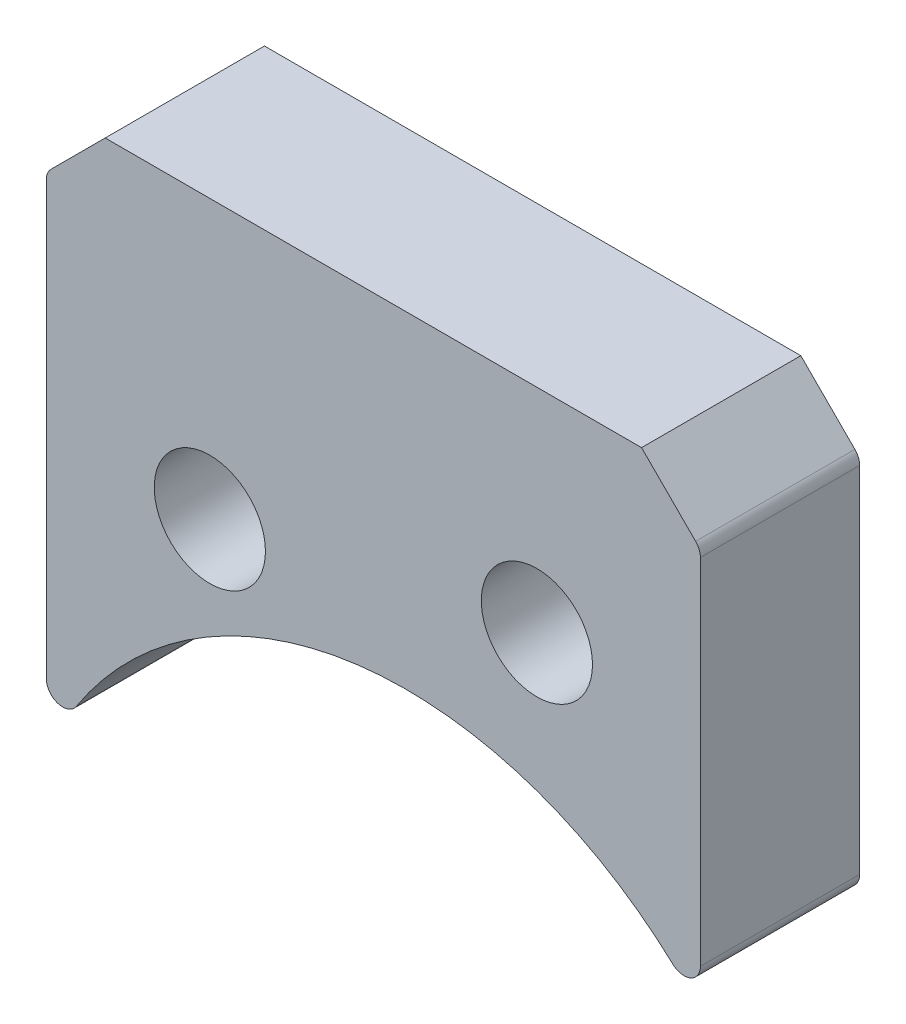
ISO-10303-21;
HEADER;
FILE_DESCRIPTION(('STEP AP214'),'2;1');
FILE_NAME('part.step','',(''),(''),'','','');
FILE_SCHEMA(('AUTOMOTIVE_DESIGN { 1 0 10303 214 1 1 1 1 }'));
ENDSEC;
DATA;
#1=APPLICATION_CONTEXT('core data for automotive mechanical design processes');
#2=APPLICATION_PROTOCOL_DEFINITION('international standard','automotive_design',2000,#1);
#3=PRODUCT_CONTEXT('',#1,'mechanical');
#4=PRODUCT('Part','Part','',(#3));
#5=PRODUCT_RELATED_PRODUCT_CATEGORY('part','',(#4));
#6=PRODUCT_DEFINITION_FORMATION('','',#4);
#7=PRODUCT_DEFINITION_CONTEXT('part definition',#1,'design');
#8=PRODUCT_DEFINITION('design','',#6,#7);
#9=PRODUCT_DEFINITION_SHAPE('','',#8);
#10=(LENGTH_UNIT() NAMED_UNIT(*) SI_UNIT(.MILLI.,.METRE.));
#11=(NAMED_UNIT(*) PLANE_ANGLE_UNIT() SI_UNIT($,.RADIAN.));
#12=(NAMED_UNIT(*) SI_UNIT($,.STERADIAN.) SOLID_ANGLE_UNIT());
#13=UNCERTAINTY_MEASURE_WITH_UNIT(LENGTH_MEASURE(1.E-05),#10,'distance_accuracy_value','');
#14=(GEOMETRIC_REPRESENTATION_CONTEXT(3) GLOBAL_UNCERTAINTY_ASSIGNED_CONTEXT((#13)) GLOBAL_UNIT_ASSIGNED_CONTEXT((#10,
#11,#12)) REPRESENTATION_CONTEXT('',''));
#15=CARTESIAN_POINT('',(0.,0.,0.));
#16=DIRECTION('',(0.,0.,1.));
#17=DIRECTION('',(1.,0.,0.));
#18=AXIS2_PLACEMENT_3D('',#15,#16,#17);
#19=CARTESIAN_POINT('',(-9.,-22.,4.87));
#20=DIRECTION('',(0.,0.,1.));
#21=DIRECTION('',(1.,0.,0.));
#22=AXIS2_PLACEMENT_3D('',#19,#20,#21);
#23=PLANE('',#22);
#24=CARTESIAN_POINT('',(-15.,-8.5,4.87));
#25=DIRECTION('',(0.,0.,1.));
#26=DIRECTION('',(1.,0.,0.));
#27=AXIS2_PLACEMENT_3D('',#24,#25,#26);
#28=CIRCLE('',#27,1.7);
#29=CARTESIAN_POINT('',(-13.3,-8.5,4.87));
#30=VERTEX_POINT('',#29);
#31=EDGE_CURVE('E161',#30,#30,#28,.T.);
#32=ORIENTED_EDGE('',*,*,#31,.F.);
#33=EDGE_LOOP('',(#32));
#34=FACE_BOUND('',#33,.T.);
#35=CARTESIAN_POINT('',(-9.,-22.,4.87));
#36=DIRECTION('',(0.,0.,-1.));
#37=DIRECTION('',(1.,0.,0.));
#38=AXIS2_PLACEMENT_3D('',#35,#36,#37);
#39=CIRCLE('',#38,12.);
#40=CARTESIAN_POINT('',(-19.08,-15.4889632161997,4.87));
#41=VERTEX_POINT('',#40);
#42=CARTESIAN_POINT('',(-0.840000000000002,-13.2014546656848,4.87));
#43=VERTEX_POINT('',#42);
#44=EDGE_CURVE('E170',#41,#43,#39,.T.);
#45=ORIENTED_EDGE('',*,*,#44,.T.);
#46=CARTESIAN_POINT('',(-0.5,-12.8348486100883,4.87));
#47=DIRECTION('',(0.,0.,1.));
#48=DIRECTION('',(1.,0.,0.));
#49=AXIS2_PLACEMENT_3D('',#46,#47,#48);
#50=CIRCLE('',#49,0.5);
#51=CARTESIAN_POINT('',(0.,-12.8348486100883,4.87));
#52=VERTEX_POINT('',#51);
#53=EDGE_CURVE('E214',#43,#52,#50,.T.);
#54=ORIENTED_EDGE('',*,*,#53,.T.);
#55=DIRECTION('',(0.,1.,0.));
#56=VECTOR('',#55,1.);
#57=CARTESIAN_POINT('',(0.,-14.0627460668062,4.87));
#58=LINE('',#57,#56);
#59=CARTESIAN_POINT('',(0.,-2.00710678118655,4.87));
#60=VERTEX_POINT('',#59);
#61=EDGE_CURVE('E168',#52,#60,#58,.T.);
#62=ORIENTED_EDGE('',*,*,#61,.T.);
#63=CARTESIAN_POINT('',(-0.5,-2.00710678118655,4.87));
#64=DIRECTION('',(0.,0.,1.));
#65=DIRECTION('',(1.,0.,0.));
#66=AXIS2_PLACEMENT_3D('',#63,#64,#65);
#67=CIRCLE('',#66,0.5);
#68=CARTESIAN_POINT('',(-0.146446609406728,-1.65355339059328,4.87));
#69=VERTEX_POINT('',#68);
#70=EDGE_CURVE('E206',#60,#69,#67,.T.);
#71=ORIENTED_EDGE('',*,*,#70,.T.);
#72=DIRECTION('',(0.707106781186546,-0.707106781186549,0.));
#73=VECTOR('',#72,1.);
#74=CARTESIAN_POINT('',(5.60000000000001,-7.40000000000004,4.87));
#75=LINE('',#74,#73);
#76=CARTESIAN_POINT('',(-1.8,0.,4.87));
#77=VERTEX_POINT('',#76);
#78=EDGE_CURVE('E176',#69,#77,#75,.F.);
#79=ORIENTED_EDGE('',*,*,#78,.T.);
#80=DIRECTION('',(-1.,0.,0.));
#81=VECTOR('',#80,1.);
#82=CARTESIAN_POINT('',(-20.,0.,4.87));
#83=LINE('',#82,#81);
#84=CARTESIAN_POINT('',(-18.2,0.,4.87));
#85=VERTEX_POINT('',#84);
#86=EDGE_CURVE('E144',#77,#85,#83,.T.);
#87=ORIENTED_EDGE('',*,*,#86,.T.);
#88=DIRECTION('',(0.707106781186549,0.707106781186546,0.));
#89=VECTOR('',#88,1.);
#90=CARTESIAN_POINT('',(-24.6,-6.39999999999996,4.87));
#91=LINE('',#90,#89);
#92=CARTESIAN_POINT('',(-19.8535533905933,-1.65355339059327,4.87));
#93=VERTEX_POINT('',#92);
#94=EDGE_CURVE('E134',#85,#93,#91,.F.);
#95=ORIENTED_EDGE('',*,*,#94,.T.);
#96=CARTESIAN_POINT('',(-19.5,-2.00710678118654,4.87));
#97=DIRECTION('',(0.,0.,1.));
#98=DIRECTION('',(1.,0.,0.));
#99=AXIS2_PLACEMENT_3D('',#96,#97,#98);
#100=CIRCLE('',#99,0.5);
#101=CARTESIAN_POINT('',(-20.,-2.00710678118654,4.87));
#102=VERTEX_POINT('',#101);
#103=EDGE_CURVE('E68',#93,#102,#100,.T.);
#104=ORIENTED_EDGE('',*,*,#103,.T.);
#105=DIRECTION('',(0.,-1.,0.));
#106=VECTOR('',#105,1.);
#107=CARTESIAN_POINT('',(-20.,-17.2041684766873,4.87));
#108=LINE('',#107,#106);
#109=CARTESIAN_POINT('',(-20.,-15.2176700168747,4.87));
#110=VERTEX_POINT('',#109);
#111=EDGE_CURVE('E234',#102,#110,#108,.T.);
#112=ORIENTED_EDGE('',*,*,#111,.T.);
#113=CARTESIAN_POINT('',(-19.5,-15.2176700168747,4.87));
#114=DIRECTION('',(0.,0.,1.));
#115=DIRECTION('',(1.,0.,0.));
#116=AXIS2_PLACEMENT_3D('',#113,#114,#115);
#117=CIRCLE('',#116,0.5);
#118=EDGE_CURVE('E211',#110,#41,#117,.T.);
#119=ORIENTED_EDGE('',*,*,#118,.T.);
#120=EDGE_LOOP('',(#45,#54,#62,#71,#79,#87,#95,#104,#112,#119));
#121=FACE_BOUND('',#120,.T.);
#122=CARTESIAN_POINT('',(-5.,-6.5,4.87));
#123=DIRECTION('',(0.,0.,1.));
#124=DIRECTION('',(1.,0.,0.));
#125=AXIS2_PLACEMENT_3D('',#122,#123,#124);
#126=CIRCLE('',#125,1.7);
#127=CARTESIAN_POINT('',(-3.3,-6.5,4.87));
#128=VERTEX_POINT('',#127);
#129=EDGE_CURVE('E258',#128,#128,#126,.T.);
#130=ORIENTED_EDGE('',*,*,#129,.F.);
#131=EDGE_LOOP('',(#130));
#132=FACE_BOUND('',#131,.T.);
#133=ADVANCED_FACE('F45',(#34,#121,#132),#23,.T.);
#134=CARTESIAN_POINT('',(-9.,-22.,0.));
#135=DIRECTION('',(0.,0.,1.));
#136=DIRECTION('',(1.,0.,0.));
#137=AXIS2_PLACEMENT_3D('',#134,#135,#136);
#138=PLANE('',#137);
#139=DIRECTION('',(0.,1.,0.));
#140=VECTOR('',#139,1.);
#141=CARTESIAN_POINT('',(0.,-14.0627460668062,0.));
#142=LINE('',#141,#140);
#143=CARTESIAN_POINT('',(0.,-12.8348486100883,0.));
#144=VERTEX_POINT('',#143);
#145=CARTESIAN_POINT('',(0.,-2.00710678118655,0.));
#146=VERTEX_POINT('',#145);
#147=EDGE_CURVE('E154',#144,#146,#142,.T.);
#148=ORIENTED_EDGE('',*,*,#147,.F.);
#149=CARTESIAN_POINT('',(-0.5,-12.8348486100883,0.));
#150=DIRECTION('',(0.,0.,1.));
#151=DIRECTION('',(1.,0.,0.));
#152=AXIS2_PLACEMENT_3D('',#149,#150,#151);
#153=CIRCLE('',#152,0.5);
#154=CARTESIAN_POINT('',(-0.840000000000002,-13.2014546656848,0.));
#155=VERTEX_POINT('',#154);
#156=EDGE_CURVE('E196',#144,#155,#153,.F.);
#157=ORIENTED_EDGE('',*,*,#156,.T.);
#158=CARTESIAN_POINT('',(-9.,-22.,0.));
#159=DIRECTION('',(0.,0.,-1.));
#160=DIRECTION('',(1.,0.,0.));
#161=AXIS2_PLACEMENT_3D('',#158,#159,#160);
#162=CIRCLE('',#161,12.);
#163=CARTESIAN_POINT('',(-19.08,-15.4889632161997,0.));
#164=VERTEX_POINT('',#163);
#165=EDGE_CURVE('E158',#164,#155,#162,.T.);
#166=ORIENTED_EDGE('',*,*,#165,.F.);
#167=CARTESIAN_POINT('',(-19.5,-15.2176700168747,0.));
#168=DIRECTION('',(0.,0.,1.));
#169=DIRECTION('',(1.,0.,0.));
#170=AXIS2_PLACEMENT_3D('',#167,#168,#169);
#171=CIRCLE('',#170,0.5);
#172=CARTESIAN_POINT('',(-20.,-15.2176700168747,0.));
#173=VERTEX_POINT('',#172);
#174=EDGE_CURVE('E193',#164,#173,#171,.F.);
#175=ORIENTED_EDGE('',*,*,#174,.T.);
#176=DIRECTION('',(0.,-1.,0.));
#177=VECTOR('',#176,1.);
#178=CARTESIAN_POINT('',(-20.,-17.2041684766873,0.));
#179=LINE('',#178,#177);
#180=CARTESIAN_POINT('',(-20.,-2.00710678118654,0.));
#181=VERTEX_POINT('',#180);
#182=EDGE_CURVE('E153',#181,#173,#179,.T.);
#183=ORIENTED_EDGE('',*,*,#182,.F.);
#184=CARTESIAN_POINT('',(-19.5,-2.00710678118654,0.));
#185=DIRECTION('',(0.,0.,1.));
#186=DIRECTION('',(1.,0.,0.));
#187=AXIS2_PLACEMENT_3D('',#184,#185,#186);
#188=CIRCLE('',#187,0.5);
#189=CARTESIAN_POINT('',(-19.8535533905933,-1.65355339059327,0.));
#190=VERTEX_POINT('',#189);
#191=EDGE_CURVE('E190',#181,#190,#188,.F.);
#192=ORIENTED_EDGE('',*,*,#191,.T.);
#193=DIRECTION('',(-0.707106781186549,-0.707106781186546,0.));
#194=VECTOR('',#193,1.);
#195=CARTESIAN_POINT('',(-20.,-1.8,0.));
#196=LINE('',#195,#194);
#197=CARTESIAN_POINT('',(-18.2,0.,0.));
#198=VERTEX_POINT('',#197);
#199=EDGE_CURVE('E135',#190,#198,#196,.F.);
#200=ORIENTED_EDGE('',*,*,#199,.T.);
#201=DIRECTION('',(-1.,0.,0.));
#202=VECTOR('',#201,1.);
#203=CARTESIAN_POINT('',(-20.,0.,0.));
#204=LINE('',#203,#202);
#205=CARTESIAN_POINT('',(-1.8,0.,0.));
#206=VERTEX_POINT('',#205);
#207=EDGE_CURVE('E141',#206,#198,#204,.T.);
#208=ORIENTED_EDGE('',*,*,#207,.F.);
#209=DIRECTION('',(-0.707106781186546,0.707106781186549,0.));
#210=VECTOR('',#209,1.);
#211=CARTESIAN_POINT('',(-1.8,0.,0.));
#212=LINE('',#211,#210);
#213=CARTESIAN_POINT('',(-0.146446609406726,-1.65355339059328,0.));
#214=VERTEX_POINT('',#213);
#215=EDGE_CURVE('E124',#206,#214,#212,.F.);
#216=ORIENTED_EDGE('',*,*,#215,.T.);
#217=CARTESIAN_POINT('',(-0.5,-2.00710678118655,0.));
#218=DIRECTION('',(0.,0.,1.));
#219=DIRECTION('',(1.,0.,0.));
#220=AXIS2_PLACEMENT_3D('',#217,#218,#219);
#221=CIRCLE('',#220,0.5);
#222=EDGE_CURVE('E187',#214,#146,#221,.F.);
#223=ORIENTED_EDGE('',*,*,#222,.T.);
#224=EDGE_LOOP('',(#148,#157,#166,#175,#183,#192,#200,#208,#216,#223));
#225=FACE_BOUND('',#224,.T.);
#226=CARTESIAN_POINT('',(-15.,-8.5,0.));
#227=DIRECTION('',(0.,0.,1.));
#228=DIRECTION('',(1.,0.,0.));
#229=AXIS2_PLACEMENT_3D('',#226,#227,#228);
#230=CIRCLE('',#229,1.7);
#231=CARTESIAN_POINT('',(-13.3,-8.5,0.));
#232=VERTEX_POINT('',#231);
#233=EDGE_CURVE('E254',#232,#232,#230,.T.);
#234=ORIENTED_EDGE('',*,*,#233,.T.);
#235=EDGE_LOOP('',(#234));
#236=FACE_BOUND('',#235,.T.);
#237=CARTESIAN_POINT('',(-5.,-6.5,0.));
#238=DIRECTION('',(0.,0.,1.));
#239=DIRECTION('',(1.,0.,0.));
#240=AXIS2_PLACEMENT_3D('',#237,#238,#239);
#241=CIRCLE('',#240,1.7);
#242=CARTESIAN_POINT('',(-3.3,-6.5,0.));
#243=VERTEX_POINT('',#242);
#244=EDGE_CURVE('E262',#243,#243,#241,.T.);
#245=ORIENTED_EDGE('',*,*,#244,.T.);
#246=EDGE_LOOP('',(#245));
#247=FACE_BOUND('',#246,.T.);
#248=ADVANCED_FACE('F149',(#225,#236,#247),#138,.F.);
#249=CARTESIAN_POINT('',(0.,-14.0627460668062,4.87));
#250=DIRECTION('',(-1.,0.,0.));
#251=DIRECTION('',(0.,0.,1.));
#252=AXIS2_PLACEMENT_3D('',#249,#250,#251);
#253=PLANE('',#252);
#254=ORIENTED_EDGE('',*,*,#61,.F.);
#255=DIRECTION('',(0.,0.,-1.));
#256=VECTOR('',#255,1.);
#257=CARTESIAN_POINT('',(0.,-12.8348486100883,4.87));
#258=LINE('',#257,#256);
#259=EDGE_CURVE('E183',#52,#144,#258,.T.);
#260=ORIENTED_EDGE('',*,*,#259,.T.);
#261=ORIENTED_EDGE('',*,*,#147,.T.);
#262=DIRECTION('',(0.,0.,-1.));
#263=VECTOR('',#262,1.);
#264=CARTESIAN_POINT('',(0.,-2.00710678118655,4.87));
#265=LINE('',#264,#263);
#266=EDGE_CURVE('E179',#146,#60,#265,.F.);
#267=ORIENTED_EDGE('',*,*,#266,.T.);
#268=EDGE_LOOP('',(#254,#260,#261,#267));
#269=FACE_BOUND('',#268,.T.);
#270=ADVANCED_FACE('F278',(#269),#253,.F.);
#271=CARTESIAN_POINT('',(-20.,0.,4.87));
#272=DIRECTION('',(0.,-1.,0.));
#273=DIRECTION('',(0.,0.,-1.));
#274=AXIS2_PLACEMENT_3D('',#271,#272,#273);
#275=PLANE('',#274);
#276=ORIENTED_EDGE('',*,*,#86,.F.);
#277=DIRECTION('',(0.,0.,-1.));
#278=VECTOR('',#277,1.);
#279=CARTESIAN_POINT('',(-1.8,0.,4.87));
#280=LINE('',#279,#278);
#281=EDGE_CURVE('E128',#77,#206,#280,.T.);
#282=ORIENTED_EDGE('',*,*,#281,.T.);
#283=ORIENTED_EDGE('',*,*,#207,.T.);
#284=DIRECTION('',(0.,0.,1.));
#285=VECTOR('',#284,1.);
#286=CARTESIAN_POINT('',(-18.2,0.,4.87));
#287=LINE('',#286,#285);
#288=EDGE_CURVE('E146',#198,#85,#287,.T.);
#289=ORIENTED_EDGE('',*,*,#288,.T.);
#290=EDGE_LOOP('',(#276,#282,#283,#289));
#291=FACE_BOUND('',#290,.T.);
#292=ADVANCED_FACE('F140',(#291),#275,.F.);
#293=CARTESIAN_POINT('',(-20.,-17.2041684766873,4.87));
#294=DIRECTION('',(1.,0.,0.));
#295=DIRECTION('',(0.,0.,-1.));
#296=AXIS2_PLACEMENT_3D('',#293,#294,#295);
#297=PLANE('',#296);
#298=ORIENTED_EDGE('',*,*,#182,.T.);
#299=DIRECTION('',(0.,0.,-1.));
#300=VECTOR('',#299,1.);
#301=CARTESIAN_POINT('',(-20.,-15.2176700168747,4.87));
#302=LINE('',#301,#300);
#303=EDGE_CURVE('E61',#173,#110,#302,.F.);
#304=ORIENTED_EDGE('',*,*,#303,.T.);
#305=ORIENTED_EDGE('',*,*,#111,.F.);
#306=DIRECTION('',(0.,0.,1.));
#307=VECTOR('',#306,1.);
#308=CARTESIAN_POINT('',(-20.,-2.00710678118654,0.));
#309=LINE('',#308,#307);
#310=EDGE_CURVE('E217',#102,#181,#309,.F.);
#311=ORIENTED_EDGE('',*,*,#310,.T.);
#312=EDGE_LOOP('',(#298,#304,#305,#311));
#313=FACE_BOUND('',#312,.T.);
#314=ADVANCED_FACE('F233',(#313),#297,.F.);
#315=CARTESIAN_POINT('',(-9.,-22.,4.87));
#316=DIRECTION('',(0.,0.,-1.));
#317=DIRECTION('',(-1.,0.,0.));
#318=AXIS2_PLACEMENT_3D('',#315,#316,#317);
#319=CYLINDRICAL_SURFACE('',#318,12.);
#320=ORIENTED_EDGE('',*,*,#165,.T.);
#321=DIRECTION('',(0.,0.,-1.));
#322=VECTOR('',#321,1.);
#323=CARTESIAN_POINT('',(-0.840000000000001,-13.2014546656848,4.87));
#324=LINE('',#323,#322);
#325=EDGE_CURVE('E203',#155,#43,#324,.F.);
#326=ORIENTED_EDGE('',*,*,#325,.T.);
#327=ORIENTED_EDGE('',*,*,#44,.F.);
#328=DIRECTION('',(0.,0.,-1.));
#329=VECTOR('',#328,1.);
#330=CARTESIAN_POINT('',(-19.08,-15.4889632161997,4.87));
#331=LINE('',#330,#329);
#332=EDGE_CURVE('E199',#41,#164,#331,.T.);
#333=ORIENTED_EDGE('',*,*,#332,.T.);
#334=EDGE_LOOP('',(#320,#326,#327,#333));
#335=FACE_BOUND('',#334,.T.);
#336=ADVANCED_FACE('F242',(#335),#319,.F.);
#337=CARTESIAN_POINT('',(-15.,-8.5,4.87));
#338=DIRECTION('',(0.,0.,-1.));
#339=DIRECTION('',(-1.,0.,0.));
#340=AXIS2_PLACEMENT_3D('',#337,#338,#339);
#341=CYLINDRICAL_SURFACE('',#340,1.7);
#342=ORIENTED_EDGE('',*,*,#31,.T.);
#343=EDGE_LOOP('',(#342));
#344=FACE_BOUND('',#343,.T.);
#345=ORIENTED_EDGE('',*,*,#233,.F.);
#346=EDGE_LOOP('',(#345));
#347=FACE_BOUND('',#346,.T.);
#348=ADVANCED_FACE('F282',(#344,#347),#341,.F.);
#349=CARTESIAN_POINT('',(-5.,-6.5,4.87));
#350=DIRECTION('',(0.,0.,-1.));
#351=DIRECTION('',(-1.,0.,0.));
#352=AXIS2_PLACEMENT_3D('',#349,#350,#351);
#353=CYLINDRICAL_SURFACE('',#352,1.7);
#354=ORIENTED_EDGE('',*,*,#129,.T.);
#355=EDGE_LOOP('',(#354));
#356=FACE_BOUND('',#355,.T.);
#357=ORIENTED_EDGE('',*,*,#244,.F.);
#358=EDGE_LOOP('',(#357));
#359=FACE_BOUND('',#358,.T.);
#360=ADVANCED_FACE('F270',(#356,#359),#353,.F.);
#361=CARTESIAN_POINT('',(-1.8,0.,4.87));
#362=DIRECTION('',(-0.707106781186549,-0.707106781186546,0.));
#363=DIRECTION('',(0.,0.,-1.));
#364=AXIS2_PLACEMENT_3D('',#361,#362,#363);
#365=PLANE('',#364);
#366=ORIENTED_EDGE('',*,*,#78,.F.);
#367=DIRECTION('',(0.,0.,1.));
#368=VECTOR('',#367,1.);
#369=CARTESIAN_POINT('',(-0.146446609406726,-1.65355339059328,0.));
#370=LINE('',#369,#368);
#371=EDGE_CURVE('E11',#69,#214,#370,.F.);
#372=ORIENTED_EDGE('',*,*,#371,.T.);
#373=ORIENTED_EDGE('',*,*,#215,.F.);
#374=ORIENTED_EDGE('',*,*,#281,.F.);
#375=EDGE_LOOP('',(#366,#372,#373,#374));
#376=FACE_BOUND('',#375,.T.);
#377=ADVANCED_FACE('F127',(#376),#365,.F.);
#378=CARTESIAN_POINT('',(-20.,-1.8,4.87));
#379=DIRECTION('',(0.707106781186546,-0.707106781186549,0.));
#380=DIRECTION('',(0.,0.,-1.));
#381=AXIS2_PLACEMENT_3D('',#378,#379,#380);
#382=PLANE('',#381);
#383=ORIENTED_EDGE('',*,*,#199,.F.);
#384=DIRECTION('',(0.,0.,-1.));
#385=VECTOR('',#384,1.);
#386=CARTESIAN_POINT('',(-19.8535533905933,-1.65355339059327,4.87));
#387=LINE('',#386,#385);
#388=EDGE_CURVE('E54',#190,#93,#387,.F.);
#389=ORIENTED_EDGE('',*,*,#388,.T.);
#390=ORIENTED_EDGE('',*,*,#94,.F.);
#391=ORIENTED_EDGE('',*,*,#288,.F.);
#392=EDGE_LOOP('',(#383,#389,#390,#391));
#393=FACE_BOUND('',#392,.T.);
#394=ADVANCED_FACE('F226',(#393),#382,.F.);
#395=CARTESIAN_POINT('',(-0.5,-12.8348486100883,4.87));
#396=DIRECTION('',(0.,0.,-1.));
#397=DIRECTION('',(-1.,0.,0.));
#398=AXIS2_PLACEMENT_3D('',#395,#396,#397);
#399=CYLINDRICAL_SURFACE('',#398,0.5);
#400=ORIENTED_EDGE('',*,*,#53,.F.);
#401=ORIENTED_EDGE('',*,*,#325,.F.);
#402=ORIENTED_EDGE('',*,*,#156,.F.);
#403=ORIENTED_EDGE('',*,*,#259,.F.);
#404=EDGE_LOOP('',(#400,#401,#402,#403));
#405=FACE_BOUND('',#404,.T.);
#406=ADVANCED_FACE('F304',(#405),#399,.T.);
#407=CARTESIAN_POINT('',(-19.5,-15.2176700168747,4.87));
#408=DIRECTION('',(0.,0.,-1.));
#409=DIRECTION('',(-1.,0.,0.));
#410=AXIS2_PLACEMENT_3D('',#407,#408,#409);
#411=CYLINDRICAL_SURFACE('',#410,0.5);
#412=ORIENTED_EDGE('',*,*,#118,.F.);
#413=ORIENTED_EDGE('',*,*,#303,.F.);
#414=ORIENTED_EDGE('',*,*,#174,.F.);
#415=ORIENTED_EDGE('',*,*,#332,.F.);
#416=EDGE_LOOP('',(#412,#413,#414,#415));
#417=FACE_BOUND('',#416,.T.);
#418=ADVANCED_FACE('F239',(#417),#411,.T.);
#419=CARTESIAN_POINT('',(-19.5,-2.00710678118654,4.87));
#420=DIRECTION('',(0.,0.,-1.));
#421=DIRECTION('',(-1.,0.,0.));
#422=AXIS2_PLACEMENT_3D('',#419,#420,#421);
#423=CYLINDRICAL_SURFACE('',#422,0.5);
#424=ORIENTED_EDGE('',*,*,#103,.F.);
#425=ORIENTED_EDGE('',*,*,#388,.F.);
#426=ORIENTED_EDGE('',*,*,#191,.F.);
#427=ORIENTED_EDGE('',*,*,#310,.F.);
#428=EDGE_LOOP('',(#424,#425,#426,#427));
#429=FACE_BOUND('',#428,.T.);
#430=ADVANCED_FACE('F231',(#429),#423,.T.);
#431=CARTESIAN_POINT('',(-0.5,-2.00710678118655,4.87));
#432=DIRECTION('',(0.,0.,1.));
#433=DIRECTION('',(1.,0.,0.));
#434=AXIS2_PLACEMENT_3D('',#431,#432,#433);
#435=CYLINDRICAL_SURFACE('',#434,0.5);
#436=ORIENTED_EDGE('',*,*,#222,.F.);
#437=ORIENTED_EDGE('',*,*,#371,.F.);
#438=ORIENTED_EDGE('',*,*,#70,.F.);
#439=ORIENTED_EDGE('',*,*,#266,.F.);
#440=EDGE_LOOP('',(#436,#437,#438,#439));
#441=FACE_BOUND('',#440,.T.);
#442=ADVANCED_FACE('F47',(#441),#435,.T.);
#443=CLOSED_SHELL('',(#133,#248,#270,#292,#314,#336,#348,#360,#377,#394,#406,#418,#430,#442));
#444=MANIFOLD_SOLID_BREP('B2',#443);
#445=ADVANCED_BREP_SHAPE_REPRESENTATION('',(#18,#444),#14);
#446=SHAPE_DEFINITION_REPRESENTATION(#9,#445);
ENDSEC;
END-ISO-10303-21;
